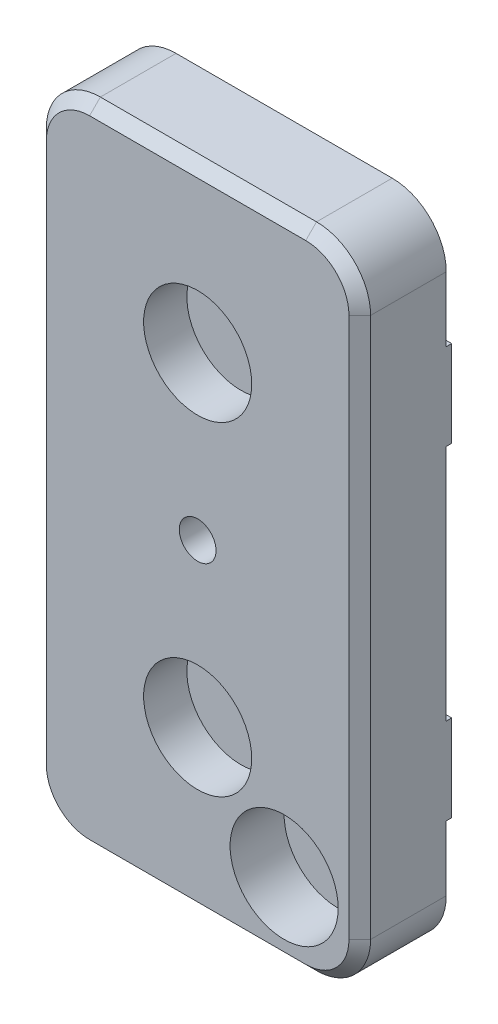
ISO-10303-21;
HEADER;
FILE_DESCRIPTION(('STEP AP214'),'2;1');
FILE_NAME('part.step','',(''),(''),'','','');
FILE_SCHEMA(('AUTOMOTIVE_DESIGN { 1 0 10303 214 1 1 1 1 }'));
ENDSEC;
DATA;
#1=APPLICATION_CONTEXT('core data for automotive mechanical design processes');
#2=APPLICATION_PROTOCOL_DEFINITION('international standard','automotive_design',2000,#1);
#3=PRODUCT_CONTEXT('',#1,'mechanical');
#4=PRODUCT('Part','Part','',(#3));
#5=PRODUCT_RELATED_PRODUCT_CATEGORY('part','',(#4));
#6=PRODUCT_DEFINITION_FORMATION('','',#4);
#7=PRODUCT_DEFINITION_CONTEXT('part definition',#1,'design');
#8=PRODUCT_DEFINITION('design','',#6,#7);
#9=PRODUCT_DEFINITION_SHAPE('','',#8);
#10=(LENGTH_UNIT() NAMED_UNIT(*) SI_UNIT(.MILLI.,.METRE.));
#11=(NAMED_UNIT(*) PLANE_ANGLE_UNIT() SI_UNIT($,.RADIAN.));
#12=(NAMED_UNIT(*) SI_UNIT($,.STERADIAN.) SOLID_ANGLE_UNIT());
#13=UNCERTAINTY_MEASURE_WITH_UNIT(LENGTH_MEASURE(1.E-05),#10,'distance_accuracy_value','');
#14=(GEOMETRIC_REPRESENTATION_CONTEXT(3) GLOBAL_UNCERTAINTY_ASSIGNED_CONTEXT((#13)) GLOBAL_UNIT_ASSIGNED_CONTEXT((#10,
#11,#12)) REPRESENTATION_CONTEXT('',''));
#15=CARTESIAN_POINT('',(0.,0.,0.));
#16=DIRECTION('',(0.,0.,1.));
#17=DIRECTION('',(1.,0.,0.));
#18=AXIS2_PLACEMENT_3D('',#15,#16,#17);
#19=CARTESIAN_POINT('',(0.,-15.,0.));
#20=DIRECTION('',(0.,0.,1.));
#21=DIRECTION('',(1.,0.,0.));
#22=AXIS2_PLACEMENT_3D('',#19,#20,#21);
#23=CYLINDRICAL_SURFACE('',#22,2.24999999999999);
#24=CARTESIAN_POINT('',(0.,-15.,-8.5));
#25=DIRECTION('',(0.,0.,1.));
#26=DIRECTION('',(0.,-1.,0.));
#27=AXIS2_PLACEMENT_3D('',#24,#25,#26);
#28=CIRCLE('',#27,2.24999999999999);
#29=CARTESIAN_POINT('',(0.,-17.25,-8.5));
#30=VERTEX_POINT('',#29);
#31=EDGE_CURVE('E207',#30,#30,#28,.T.);
#32=ORIENTED_EDGE('',*,*,#31,.F.);
#33=EDGE_LOOP('',(#32));
#34=FACE_BOUND('',#33,.T.);
#35=CARTESIAN_POINT('',(0.,-15.,-4.4));
#36=DIRECTION('',(0.,0.,1.));
#37=DIRECTION('',(1.,0.,0.));
#38=AXIS2_PLACEMENT_3D('',#35,#36,#37);
#39=CIRCLE('',#38,2.24999999999999);
#40=CARTESIAN_POINT('',(2.24999999999999,-15.,-4.4));
#41=VERTEX_POINT('',#40);
#42=EDGE_CURVE('E11',#41,#41,#39,.F.);
#43=ORIENTED_EDGE('',*,*,#42,.F.);
#44=EDGE_LOOP('',(#43));
#45=FACE_BOUND('',#44,.T.);
#46=ADVANCED_FACE('F32',(#34,#45),#23,.F.);
#47=CARTESIAN_POINT('',(0.,15.,0.));
#48=DIRECTION('',(0.,0.,1.));
#49=DIRECTION('',(1.,0.,0.));
#50=AXIS2_PLACEMENT_3D('',#47,#48,#49);
#51=CYLINDRICAL_SURFACE('',#50,2.24999999999999);
#52=CARTESIAN_POINT('',(0.,15.,-8.5));
#53=DIRECTION('',(0.,0.,1.));
#54=DIRECTION('',(1.,0.,0.));
#55=AXIS2_PLACEMENT_3D('',#52,#53,#54);
#56=CIRCLE('',#55,2.24999999999999);
#57=CARTESIAN_POINT('',(2.24999999999999,15.,-8.5));
#58=VERTEX_POINT('',#57);
#59=EDGE_CURVE('E486',#58,#58,#56,.T.);
#60=ORIENTED_EDGE('',*,*,#59,.F.);
#61=EDGE_LOOP('',(#60));
#62=FACE_BOUND('',#61,.T.);
#63=CARTESIAN_POINT('',(0.,15.,-4.4));
#64=DIRECTION('',(0.,0.,1.));
#65=DIRECTION('',(1.,0.,0.));
#66=AXIS2_PLACEMENT_3D('',#63,#64,#65);
#67=CIRCLE('',#66,2.24999999999999);
#68=CARTESIAN_POINT('',(2.24999999999999,15.,-4.4));
#69=VERTEX_POINT('',#68);
#70=EDGE_CURVE('E40',#69,#69,#67,.F.);
#71=ORIENTED_EDGE('',*,*,#70,.F.);
#72=EDGE_LOOP('',(#71));
#73=FACE_BOUND('',#72,.T.);
#74=ADVANCED_FACE('F293',(#62,#73),#51,.F.);
#75=CARTESIAN_POINT('',(15.,11.,-8.));
#76=DIRECTION('',(0.,0.,1.));
#77=DIRECTION('',(0.,-1.,0.));
#78=AXIS2_PLACEMENT_3D('',#75,#76,#77);
#79=PLANE('',#78);
#80=CARTESIAN_POINT('',(0.,0.,-8.));
#81=DIRECTION('',(0.,0.,1.));
#82=DIRECTION('',(0.,-1.,0.));
#83=AXIS2_PLACEMENT_3D('',#80,#81,#82);
#84=CIRCLE('',#83,3.25);
#85=CARTESIAN_POINT('',(0.,-3.25,-8.));
#86=VERTEX_POINT('',#85);
#87=EDGE_CURVE('E205',#86,#86,#84,.T.);
#88=ORIENTED_EDGE('',*,*,#87,.T.);
#89=EDGE_LOOP('',(#88));
#90=FACE_BOUND('',#89,.T.);
#91=DIRECTION('',(0.,1.,0.));
#92=VECTOR('',#91,1.);
#93=CARTESIAN_POINT('',(-15.,11.,-8.));
#94=LINE('',#93,#92);
#95=CARTESIAN_POINT('',(-15.,-11.,-8.));
#96=VERTEX_POINT('',#95);
#97=CARTESIAN_POINT('',(-15.,11.,-8.));
#98=VERTEX_POINT('',#97);
#99=EDGE_CURVE('E196',#96,#98,#94,.T.);
#100=ORIENTED_EDGE('',*,*,#99,.T.);
#101=DIRECTION('',(-1.,0.,0.));
#102=VECTOR('',#101,1.);
#103=CARTESIAN_POINT('',(15.,11.,-8.));
#104=LINE('',#103,#102);
#105=CARTESIAN_POINT('',(15.,11.,-8.));
#106=VERTEX_POINT('',#105);
#107=EDGE_CURVE('E175',#106,#98,#104,.T.);
#108=ORIENTED_EDGE('',*,*,#107,.F.);
#109=DIRECTION('',(0.,1.,0.));
#110=VECTOR('',#109,1.);
#111=CARTESIAN_POINT('',(15.,11.,-8.));
#112=LINE('',#111,#110);
#113=CARTESIAN_POINT('',(15.,-11.,-8.));
#114=VERTEX_POINT('',#113);
#115=EDGE_CURVE('E182',#114,#106,#112,.T.);
#116=ORIENTED_EDGE('',*,*,#115,.F.);
#117=DIRECTION('',(-1.,0.,0.));
#118=VECTOR('',#117,1.);
#119=CARTESIAN_POINT('',(15.,-11.,-8.));
#120=LINE('',#119,#118);
#121=EDGE_CURVE('E466',#114,#96,#120,.T.);
#122=ORIENTED_EDGE('',*,*,#121,.T.);
#123=EDGE_LOOP('',(#100,#108,#116,#122));
#124=FACE_BOUND('',#123,.T.);
#125=ADVANCED_FACE('F194',(#90,#124),#79,.F.);
#126=CARTESIAN_POINT('',(15.,11.,-8.));
#127=DIRECTION('',(0.,1.,0.));
#128=DIRECTION('',(0.,0.,1.));
#129=AXIS2_PLACEMENT_3D('',#126,#127,#128);
#130=PLANE('',#129);
#131=DIRECTION('',(0.,0.,-1.));
#132=VECTOR('',#131,1.);
#133=CARTESIAN_POINT('',(-15.,11.,-8.));
#134=LINE('',#133,#132);
#135=CARTESIAN_POINT('',(-15.,11.,-8.5));
#136=VERTEX_POINT('',#135);
#137=EDGE_CURVE('E456',#98,#136,#134,.T.);
#138=ORIENTED_EDGE('',*,*,#137,.T.);
#139=DIRECTION('',(-1.,0.,0.));
#140=VECTOR('',#139,1.);
#141=CARTESIAN_POINT('',(15.,11.,-8.5));
#142=LINE('',#141,#140);
#143=CARTESIAN_POINT('',(15.,11.,-8.5));
#144=VERTEX_POINT('',#143);
#145=EDGE_CURVE('E178',#144,#136,#142,.T.);
#146=ORIENTED_EDGE('',*,*,#145,.F.);
#147=DIRECTION('',(0.,0.,-1.));
#148=VECTOR('',#147,1.);
#149=CARTESIAN_POINT('',(15.,11.,-8.));
#150=LINE('',#149,#148);
#151=EDGE_CURVE('E171',#106,#144,#150,.T.);
#152=ORIENTED_EDGE('',*,*,#151,.F.);
#153=ORIENTED_EDGE('',*,*,#107,.T.);
#154=EDGE_LOOP('',(#138,#146,#152,#153));
#155=FACE_BOUND('',#154,.T.);
#156=ADVANCED_FACE('F173',(#155),#130,.F.);
#157=CARTESIAN_POINT('',(15.,11.,-8.5));
#158=DIRECTION('',(0.,0.,1.));
#159=DIRECTION('',(1.,0.,0.));
#160=AXIS2_PLACEMENT_3D('',#157,#158,#159);
#161=PLANE('',#160);
#162=ORIENTED_EDGE('',*,*,#59,.T.);
#163=EDGE_LOOP('',(#162));
#164=FACE_BOUND('',#163,.T.);
#165=DIRECTION('',(0.,1.,0.));
#166=VECTOR('',#165,1.);
#167=CARTESIAN_POINT('',(-15.,11.,-8.5));
#168=LINE('',#167,#166);
#169=CARTESIAN_POINT('',(-15.,19.,-8.5));
#170=VERTEX_POINT('',#169);
#171=EDGE_CURVE('E450',#136,#170,#168,.T.);
#172=ORIENTED_EDGE('',*,*,#171,.T.);
#173=DIRECTION('',(-1.,0.,0.));
#174=VECTOR('',#173,1.);
#175=CARTESIAN_POINT('',(15.,19.,-8.5));
#176=LINE('',#175,#174);
#177=CARTESIAN_POINT('',(15.,19.,-8.5));
#178=VERTEX_POINT('',#177);
#179=EDGE_CURVE('E201',#178,#170,#176,.T.);
#180=ORIENTED_EDGE('',*,*,#179,.F.);
#181=DIRECTION('',(0.,1.,0.));
#182=VECTOR('',#181,1.);
#183=CARTESIAN_POINT('',(15.,11.,-8.5));
#184=LINE('',#183,#182);
#185=EDGE_CURVE('E181',#144,#178,#184,.T.);
#186=ORIENTED_EDGE('',*,*,#185,.F.);
#187=ORIENTED_EDGE('',*,*,#145,.T.);
#188=EDGE_LOOP('',(#172,#180,#186,#187));
#189=FACE_BOUND('',#188,.T.);
#190=ADVANCED_FACE('F349',(#164,#189),#161,.F.);
#191=CARTESIAN_POINT('',(15.,19.,-7.99999999999999));
#192=DIRECTION('',(0.,-1.,0.));
#193=DIRECTION('',(0.,0.,-1.));
#194=AXIS2_PLACEMENT_3D('',#191,#192,#193);
#195=PLANE('',#194);
#196=DIRECTION('',(0.,0.,1.));
#197=VECTOR('',#196,1.);
#198=CARTESIAN_POINT('',(-15.,19.,-7.99999999999999));
#199=LINE('',#198,#197);
#200=CARTESIAN_POINT('',(-15.,19.,-7.99999999999999));
#201=VERTEX_POINT('',#200);
#202=EDGE_CURVE('E445',#170,#201,#199,.T.);
#203=ORIENTED_EDGE('',*,*,#202,.T.);
#204=DIRECTION('',(-1.,0.,0.));
#205=VECTOR('',#204,1.);
#206=CARTESIAN_POINT('',(15.,19.,-7.99999999999999));
#207=LINE('',#206,#205);
#208=CARTESIAN_POINT('',(15.,19.,-7.99999999999999));
#209=VERTEX_POINT('',#208);
#210=EDGE_CURVE('E432',#209,#201,#207,.T.);
#211=ORIENTED_EDGE('',*,*,#210,.F.);
#212=DIRECTION('',(0.,0.,1.));
#213=VECTOR('',#212,1.);
#214=CARTESIAN_POINT('',(15.,19.,-7.99999999999999));
#215=LINE('',#214,#213);
#216=EDGE_CURVE('E446',#178,#209,#215,.T.);
#217=ORIENTED_EDGE('',*,*,#216,.F.);
#218=ORIENTED_EDGE('',*,*,#179,.T.);
#219=EDGE_LOOP('',(#203,#211,#217,#218));
#220=FACE_BOUND('',#219,.T.);
#221=ADVANCED_FACE('F345',(#220),#195,.F.);
#222=CARTESIAN_POINT('',(15.,19.,-7.99999999999999));
#223=DIRECTION('',(0.,0.,1.));
#224=DIRECTION('',(1.,0.,0.));
#225=AXIS2_PLACEMENT_3D('',#222,#223,#224);
#226=PLANE('',#225);
#227=DIRECTION('',(0.,1.,0.));
#228=VECTOR('',#227,1.);
#229=CARTESIAN_POINT('',(-15.,19.,-7.99999999999999));
#230=LINE('',#229,#228);
#231=CARTESIAN_POINT('',(-15.,25.,-7.99999999999999));
#232=VERTEX_POINT('',#231);
#233=EDGE_CURVE('E452',#201,#232,#230,.T.);
#234=ORIENTED_EDGE('',*,*,#233,.T.);
#235=CARTESIAN_POINT('',(-10.,25.,-7.99999999999999));
#236=DIRECTION('',(0.,0.,1.));
#237=DIRECTION('',(1.,0.,0.));
#238=AXIS2_PLACEMENT_3D('',#235,#236,#237);
#239=CIRCLE('',#238,5.);
#240=CARTESIAN_POINT('',(-10.,30.,-7.99999999999999));
#241=VERTEX_POINT('',#240);
#242=EDGE_CURVE('E218',#232,#241,#239,.F.);
#243=ORIENTED_EDGE('',*,*,#242,.T.);
#244=DIRECTION('',(-1.,0.,0.));
#245=VECTOR('',#244,1.);
#246=CARTESIAN_POINT('',(15.,30.,-7.99999999999999));
#247=LINE('',#246,#245);
#248=CARTESIAN_POINT('',(10.,30.,-7.99999999999999));
#249=VERTEX_POINT('',#248);
#250=EDGE_CURVE('E428',#249,#241,#247,.T.);
#251=ORIENTED_EDGE('',*,*,#250,.F.);
#252=CARTESIAN_POINT('',(10.,25.,-7.99999999999999));
#253=DIRECTION('',(0.,0.,1.));
#254=DIRECTION('',(1.,0.,0.));
#255=AXIS2_PLACEMENT_3D('',#252,#253,#254);
#256=CIRCLE('',#255,5.);
#257=CARTESIAN_POINT('',(15.,25.,-7.99999999999999));
#258=VERTEX_POINT('',#257);
#259=EDGE_CURVE('E216',#249,#258,#256,.F.);
#260=ORIENTED_EDGE('',*,*,#259,.T.);
#261=DIRECTION('',(0.,1.,0.));
#262=VECTOR('',#261,1.);
#263=CARTESIAN_POINT('',(15.,19.,-7.99999999999999));
#264=LINE('',#263,#262);
#265=EDGE_CURVE('E488',#209,#258,#264,.T.);
#266=ORIENTED_EDGE('',*,*,#265,.F.);
#267=ORIENTED_EDGE('',*,*,#210,.T.);
#268=EDGE_LOOP('',(#234,#243,#251,#260,#266,#267));
#269=FACE_BOUND('',#268,.T.);
#270=ADVANCED_FACE('F342',(#269),#226,.F.);
#271=CARTESIAN_POINT('',(15.,30.,-7.99999999999999));
#272=DIRECTION('',(0.,-1.,0.));
#273=DIRECTION('',(0.,0.,-1.));
#274=AXIS2_PLACEMENT_3D('',#271,#272,#273);
#275=PLANE('',#274);
#276=DIRECTION('',(0.,0.,1.));
#277=VECTOR('',#276,1.);
#278=CARTESIAN_POINT('',(-10.,30.,-7.99999999999999));
#279=LINE('',#278,#277);
#280=CARTESIAN_POINT('',(-10.,30.,-1.00000000000001));
#281=VERTEX_POINT('',#280);
#282=EDGE_CURVE('E199',#241,#281,#279,.T.);
#283=ORIENTED_EDGE('',*,*,#282,.T.);
#284=DIRECTION('',(1.,0.,0.));
#285=VECTOR('',#284,1.);
#286=CARTESIAN_POINT('',(15.,30.,-1.00000000000001));
#287=LINE('',#286,#285);
#288=CARTESIAN_POINT('',(10.,30.,-1.00000000000001));
#289=VERTEX_POINT('',#288);
#290=EDGE_CURVE('E54',#281,#289,#287,.T.);
#291=ORIENTED_EDGE('',*,*,#290,.T.);
#292=DIRECTION('',(0.,0.,1.));
#293=VECTOR('',#292,1.);
#294=CARTESIAN_POINT('',(10.,30.,-7.99999999999999));
#295=LINE('',#294,#293);
#296=EDGE_CURVE('E197',#289,#249,#295,.F.);
#297=ORIENTED_EDGE('',*,*,#296,.T.);
#298=ORIENTED_EDGE('',*,*,#250,.T.);
#299=EDGE_LOOP('',(#283,#291,#297,#298));
#300=FACE_BOUND('',#299,.T.);
#301=ADVANCED_FACE('F338',(#300),#275,.F.);
#302=CARTESIAN_POINT('',(15.,30.,0.));
#303=DIRECTION('',(0.,0.,-1.));
#304=DIRECTION('',(0.,1.,0.));
#305=AXIS2_PLACEMENT_3D('',#302,#303,#304);
#306=PLANE('',#305);
#307=CARTESIAN_POINT('',(0.,-15.,0.));
#308=DIRECTION('',(0.,0.,1.));
#309=DIRECTION('',(1.,0.,0.));
#310=AXIS2_PLACEMENT_3D('',#307,#308,#309);
#311=CIRCLE('',#310,5.);
#312=CARTESIAN_POINT('',(5.,-15.,0.));
#313=VERTEX_POINT('',#312);
#314=EDGE_CURVE('E533',#313,#313,#311,.T.);
#315=ORIENTED_EDGE('',*,*,#314,.F.);
#316=EDGE_LOOP('',(#315));
#317=FACE_BOUND('',#316,.T.);
#318=CARTESIAN_POINT('',(0.,15.,0.));
#319=DIRECTION('',(0.,0.,1.));
#320=DIRECTION('',(1.,0.,0.));
#321=AXIS2_PLACEMENT_3D('',#318,#319,#320);
#322=CIRCLE('',#321,5.);
#323=CARTESIAN_POINT('',(5.,15.,0.));
#324=VERTEX_POINT('',#323);
#325=EDGE_CURVE('E527',#324,#324,#322,.T.);
#326=ORIENTED_EDGE('',*,*,#325,.F.);
#327=EDGE_LOOP('',(#326));
#328=FACE_BOUND('',#327,.T.);
#329=CARTESIAN_POINT('',(8.,-23.,0.));
#330=DIRECTION('',(0.,0.,1.));
#331=DIRECTION('',(1.,0.,0.));
#332=AXIS2_PLACEMENT_3D('',#329,#330,#331);
#333=CIRCLE('',#332,5.);
#334=CARTESIAN_POINT('',(13.,-23.,0.));
#335=VERTEX_POINT('',#334);
#336=EDGE_CURVE('E521',#335,#335,#333,.T.);
#337=ORIENTED_EDGE('',*,*,#336,.F.);
#338=EDGE_LOOP('',(#337));
#339=FACE_BOUND('',#338,.T.);
#340=CARTESIAN_POINT('',(-10.,-25.,0.));
#341=DIRECTION('',(0.,0.,-1.));
#342=DIRECTION('',(0.,1.,0.));
#343=AXIS2_PLACEMENT_3D('',#340,#341,#342);
#344=CIRCLE('',#343,4.);
#345=CARTESIAN_POINT('',(-14.,-25.,0.));
#346=VERTEX_POINT('',#345);
#347=CARTESIAN_POINT('',(-10.,-29.,0.));
#348=VERTEX_POINT('',#347);
#349=EDGE_CURVE('E246',#346,#348,#344,.F.);
#350=ORIENTED_EDGE('',*,*,#349,.T.);
#351=DIRECTION('',(1.,0.,0.));
#352=VECTOR('',#351,1.);
#353=CARTESIAN_POINT('',(15.,-29.,0.));
#354=LINE('',#353,#352);
#355=CARTESIAN_POINT('',(10.,-29.,0.));
#356=VERTEX_POINT('',#355);
#357=EDGE_CURVE('E250',#348,#356,#354,.T.);
#358=ORIENTED_EDGE('',*,*,#357,.T.);
#359=CARTESIAN_POINT('',(10.,-25.,0.));
#360=DIRECTION('',(0.,0.,-1.));
#361=DIRECTION('',(0.,1.,0.));
#362=AXIS2_PLACEMENT_3D('',#359,#360,#361);
#363=CIRCLE('',#362,4.);
#364=CARTESIAN_POINT('',(14.,-25.,0.));
#365=VERTEX_POINT('',#364);
#366=EDGE_CURVE('E248',#356,#365,#363,.F.);
#367=ORIENTED_EDGE('',*,*,#366,.T.);
#368=DIRECTION('',(0.,1.,0.));
#369=VECTOR('',#368,1.);
#370=CARTESIAN_POINT('',(14.,25.,0.));
#371=LINE('',#370,#369);
#372=CARTESIAN_POINT('',(14.,25.,0.));
#373=VERTEX_POINT('',#372);
#374=EDGE_CURVE('E244',#365,#373,#371,.T.);
#375=ORIENTED_EDGE('',*,*,#374,.T.);
#376=CARTESIAN_POINT('',(10.,25.,0.));
#377=DIRECTION('',(0.,0.,-1.));
#378=DIRECTION('',(0.,1.,0.));
#379=AXIS2_PLACEMENT_3D('',#376,#377,#378);
#380=CIRCLE('',#379,4.);
#381=CARTESIAN_POINT('',(10.,29.,0.));
#382=VERTEX_POINT('',#381);
#383=EDGE_CURVE('E240',#373,#382,#380,.F.);
#384=ORIENTED_EDGE('',*,*,#383,.T.);
#385=DIRECTION('',(-1.,0.,0.));
#386=VECTOR('',#385,1.);
#387=CARTESIAN_POINT('',(15.,29.,0.));
#388=LINE('',#387,#386);
#389=CARTESIAN_POINT('',(-10.,29.,0.));
#390=VERTEX_POINT('',#389);
#391=EDGE_CURVE('E236',#382,#390,#388,.T.);
#392=ORIENTED_EDGE('',*,*,#391,.T.);
#393=CARTESIAN_POINT('',(-10.,25.,0.));
#394=DIRECTION('',(0.,0.,-1.));
#395=DIRECTION('',(0.,1.,0.));
#396=AXIS2_PLACEMENT_3D('',#393,#394,#395);
#397=CIRCLE('',#396,4.);
#398=CARTESIAN_POINT('',(-14.,25.,0.));
#399=VERTEX_POINT('',#398);
#400=EDGE_CURVE('E238',#390,#399,#397,.F.);
#401=ORIENTED_EDGE('',*,*,#400,.T.);
#402=DIRECTION('',(0.,-1.,0.));
#403=VECTOR('',#402,1.);
#404=CARTESIAN_POINT('',(-14.,30.,0.));
#405=LINE('',#404,#403);
#406=EDGE_CURVE('E242',#399,#346,#405,.T.);
#407=ORIENTED_EDGE('',*,*,#406,.T.);
#408=EDGE_LOOP('',(#350,#358,#367,#375,#384,#392,#401,#407));
#409=FACE_BOUND('',#408,.T.);
#410=CARTESIAN_POINT('',(0.,0.,0.));
#411=DIRECTION('',(0.,0.,-1.));
#412=DIRECTION('',(-1.,0.,0.));
#413=AXIS2_PLACEMENT_3D('',#410,#411,#412);
#414=CIRCLE('',#413,1.7);
#415=CARTESIAN_POINT('',(-1.7,0.,0.));
#416=VERTEX_POINT('',#415);
#417=EDGE_CURVE('E208',#416,#416,#414,.T.);
#418=ORIENTED_EDGE('',*,*,#417,.T.);
#419=EDGE_LOOP('',(#418));
#420=FACE_BOUND('',#419,.T.);
#421=ADVANCED_FACE('F334',(#317,#328,#339,#409,#420),#306,.F.);
#422=CARTESIAN_POINT('',(15.,-30.,-8.));
#423=DIRECTION('',(0.,1.,0.));
#424=DIRECTION('',(0.,0.,1.));
#425=AXIS2_PLACEMENT_3D('',#422,#423,#424);
#426=PLANE('',#425);
#427=DIRECTION('',(0.,0.,-1.));
#428=VECTOR('',#427,1.);
#429=CARTESIAN_POINT('',(10.,-30.,0.));
#430=LINE('',#429,#428);
#431=CARTESIAN_POINT('',(10.,-30.,-8.));
#432=VERTEX_POINT('',#431);
#433=CARTESIAN_POINT('',(10.,-30.,-1.00000000000001));
#434=VERTEX_POINT('',#433);
#435=EDGE_CURVE('E230',#432,#434,#430,.F.);
#436=ORIENTED_EDGE('',*,*,#435,.T.);
#437=DIRECTION('',(-1.,0.,0.));
#438=VECTOR('',#437,1.);
#439=CARTESIAN_POINT('',(15.,-30.,-1.00000000000001));
#440=LINE('',#439,#438);
#441=CARTESIAN_POINT('',(-10.,-30.,-1.00000000000001));
#442=VERTEX_POINT('',#441);
#443=EDGE_CURVE('E233',#434,#442,#440,.T.);
#444=ORIENTED_EDGE('',*,*,#443,.T.);
#445=DIRECTION('',(0.,0.,-1.));
#446=VECTOR('',#445,1.);
#447=CARTESIAN_POINT('',(-10.,-30.,-8.));
#448=LINE('',#447,#446);
#449=CARTESIAN_POINT('',(-10.,-30.,-8.));
#450=VERTEX_POINT('',#449);
#451=EDGE_CURVE('E228',#442,#450,#448,.T.);
#452=ORIENTED_EDGE('',*,*,#451,.T.);
#453=DIRECTION('',(-1.,0.,0.));
#454=VECTOR('',#453,1.);
#455=CARTESIAN_POINT('',(15.,-30.,-8.));
#456=LINE('',#455,#454);
#457=EDGE_CURVE('E426',#432,#450,#456,.T.);
#458=ORIENTED_EDGE('',*,*,#457,.F.);
#459=EDGE_LOOP('',(#436,#444,#452,#458));
#460=FACE_BOUND('',#459,.T.);
#461=ADVANCED_FACE('F330',(#460),#426,.F.);
#462=CARTESIAN_POINT('',(15.,-19.,-8.));
#463=DIRECTION('',(0.,0.,1.));
#464=DIRECTION('',(0.,-1.,0.));
#465=AXIS2_PLACEMENT_3D('',#462,#463,#464);
#466=PLANE('',#465);
#467=DIRECTION('',(0.,1.,0.));
#468=VECTOR('',#467,1.);
#469=CARTESIAN_POINT('',(15.,-19.,-8.));
#470=LINE('',#469,#468);
#471=CARTESIAN_POINT('',(15.,-25.,-8.));
#472=VERTEX_POINT('',#471);
#473=CARTESIAN_POINT('',(15.,-19.,-8.));
#474=VERTEX_POINT('',#473);
#475=EDGE_CURVE('E493',#472,#474,#470,.T.);
#476=ORIENTED_EDGE('',*,*,#475,.F.);
#477=CARTESIAN_POINT('',(10.,-25.,-8.));
#478=DIRECTION('',(0.,0.,1.));
#479=DIRECTION('',(0.,-1.,0.));
#480=AXIS2_PLACEMENT_3D('',#477,#478,#479);
#481=CIRCLE('',#480,5.);
#482=EDGE_CURVE('E226',#472,#432,#481,.F.);
#483=ORIENTED_EDGE('',*,*,#482,.T.);
#484=ORIENTED_EDGE('',*,*,#457,.T.);
#485=CARTESIAN_POINT('',(-10.,-25.,-8.));
#486=DIRECTION('',(0.,0.,1.));
#487=DIRECTION('',(0.,-1.,0.));
#488=AXIS2_PLACEMENT_3D('',#485,#486,#487);
#489=CIRCLE('',#488,5.);
#490=CARTESIAN_POINT('',(-15.,-25.,-8.));
#491=VERTEX_POINT('',#490);
#492=EDGE_CURVE('E224',#450,#491,#489,.F.);
#493=ORIENTED_EDGE('',*,*,#492,.T.);
#494=DIRECTION('',(0.,1.,0.));
#495=VECTOR('',#494,1.);
#496=CARTESIAN_POINT('',(-15.,-19.,-8.));
#497=LINE('',#496,#495);
#498=CARTESIAN_POINT('',(-15.,-19.,-8.));
#499=VERTEX_POINT('',#498);
#500=EDGE_CURVE('E454',#491,#499,#497,.T.);
#501=ORIENTED_EDGE('',*,*,#500,.T.);
#502=DIRECTION('',(-1.,0.,0.));
#503=VECTOR('',#502,1.);
#504=CARTESIAN_POINT('',(15.,-19.,-8.));
#505=LINE('',#504,#503);
#506=EDGE_CURVE('E429',#474,#499,#505,.T.);
#507=ORIENTED_EDGE('',*,*,#506,.F.);
#508=EDGE_LOOP('',(#476,#483,#484,#493,#501,#507));
#509=FACE_BOUND('',#508,.T.);
#510=ADVANCED_FACE('F326',(#509),#466,.F.);
#511=CARTESIAN_POINT('',(15.,-19.,-8.));
#512=DIRECTION('',(0.,1.,0.));
#513=DIRECTION('',(0.,0.,1.));
#514=AXIS2_PLACEMENT_3D('',#511,#512,#513);
#515=PLANE('',#514);
#516=DIRECTION('',(0.,0.,-1.));
#517=VECTOR('',#516,1.);
#518=CARTESIAN_POINT('',(-15.,-19.,-8.));
#519=LINE('',#518,#517);
#520=CARTESIAN_POINT('',(-15.,-19.,-8.5));
#521=VERTEX_POINT('',#520);
#522=EDGE_CURVE('E461',#499,#521,#519,.T.);
#523=ORIENTED_EDGE('',*,*,#522,.T.);
#524=DIRECTION('',(-1.,0.,0.));
#525=VECTOR('',#524,1.);
#526=CARTESIAN_POINT('',(15.,-19.,-8.5));
#527=LINE('',#526,#525);
#528=CARTESIAN_POINT('',(15.,-19.,-8.5));
#529=VERTEX_POINT('',#528);
#530=EDGE_CURVE('E435',#529,#521,#527,.T.);
#531=ORIENTED_EDGE('',*,*,#530,.F.);
#532=DIRECTION('',(0.,0.,-1.));
#533=VECTOR('',#532,1.);
#534=CARTESIAN_POINT('',(15.,-19.,-8.));
#535=LINE('',#534,#533);
#536=EDGE_CURVE('E482',#474,#529,#535,.T.);
#537=ORIENTED_EDGE('',*,*,#536,.F.);
#538=ORIENTED_EDGE('',*,*,#506,.T.);
#539=EDGE_LOOP('',(#523,#531,#537,#538));
#540=FACE_BOUND('',#539,.T.);
#541=ADVANCED_FACE('F322',(#540),#515,.F.);
#542=CARTESIAN_POINT('',(15.,-11.,-8.5));
#543=DIRECTION('',(0.,0.,1.));
#544=DIRECTION('',(0.,-1.,0.));
#545=AXIS2_PLACEMENT_3D('',#542,#543,#544);
#546=PLANE('',#545);
#547=ORIENTED_EDGE('',*,*,#31,.T.);
#548=EDGE_LOOP('',(#547));
#549=FACE_BOUND('',#548,.T.);
#550=DIRECTION('',(0.,1.,0.));
#551=VECTOR('',#550,1.);
#552=CARTESIAN_POINT('',(-15.,-11.,-8.5));
#553=LINE('',#552,#551);
#554=CARTESIAN_POINT('',(-15.,-11.,-8.5));
#555=VERTEX_POINT('',#554);
#556=EDGE_CURVE('E463',#521,#555,#553,.T.);
#557=ORIENTED_EDGE('',*,*,#556,.T.);
#558=DIRECTION('',(-1.,0.,0.));
#559=VECTOR('',#558,1.);
#560=CARTESIAN_POINT('',(15.,-11.,-8.5));
#561=LINE('',#560,#559);
#562=CARTESIAN_POINT('',(15.,-11.,-8.5));
#563=VERTEX_POINT('',#562);
#564=EDGE_CURVE('E468',#563,#555,#561,.T.);
#565=ORIENTED_EDGE('',*,*,#564,.F.);
#566=DIRECTION('',(0.,1.,0.));
#567=VECTOR('',#566,1.);
#568=CARTESIAN_POINT('',(15.,-11.,-8.5));
#569=LINE('',#568,#567);
#570=EDGE_CURVE('E476',#529,#563,#569,.T.);
#571=ORIENTED_EDGE('',*,*,#570,.F.);
#572=ORIENTED_EDGE('',*,*,#530,.T.);
#573=EDGE_LOOP('',(#557,#565,#571,#572));
#574=FACE_BOUND('',#573,.T.);
#575=ADVANCED_FACE('F318',(#549,#574),#546,.F.);
#576=CARTESIAN_POINT('',(15.,-11.,-8.));
#577=DIRECTION('',(0.,-1.,0.));
#578=DIRECTION('',(0.,0.,-1.));
#579=AXIS2_PLACEMENT_3D('',#576,#577,#578);
#580=PLANE('',#579);
#581=DIRECTION('',(0.,0.,1.));
#582=VECTOR('',#581,1.);
#583=CARTESIAN_POINT('',(-15.,-11.,-8.));
#584=LINE('',#583,#582);
#585=EDGE_CURVE('E192',#555,#96,#584,.T.);
#586=ORIENTED_EDGE('',*,*,#585,.T.);
#587=ORIENTED_EDGE('',*,*,#121,.F.);
#588=DIRECTION('',(0.,0.,1.));
#589=VECTOR('',#588,1.);
#590=CARTESIAN_POINT('',(15.,-11.,-8.));
#591=LINE('',#590,#589);
#592=EDGE_CURVE('E188',#563,#114,#591,.T.);
#593=ORIENTED_EDGE('',*,*,#592,.F.);
#594=ORIENTED_EDGE('',*,*,#564,.T.);
#595=EDGE_LOOP('',(#586,#587,#593,#594));
#596=FACE_BOUND('',#595,.T.);
#597=ADVANCED_FACE('F311',(#596),#580,.F.);
#598=CARTESIAN_POINT('',(15.,0.,0.));
#599=DIRECTION('',(1.,0.,0.));
#600=DIRECTION('',(0.,0.,-1.));
#601=AXIS2_PLACEMENT_3D('',#598,#599,#600);
#602=PLANE('',#601);
#603=DIRECTION('',(0.,0.,1.));
#604=VECTOR('',#603,1.);
#605=CARTESIAN_POINT('',(15.,25.,0.));
#606=LINE('',#605,#604);
#607=CARTESIAN_POINT('',(15.,25.,-1.00000000000001));
#608=VERTEX_POINT('',#607);
#609=EDGE_CURVE('E222',#258,#608,#606,.T.);
#610=ORIENTED_EDGE('',*,*,#609,.T.);
#611=DIRECTION('',(0.,-1.,0.));
#612=VECTOR('',#611,1.);
#613=CARTESIAN_POINT('',(15.,-25.,-1.00000000000001));
#614=LINE('',#613,#612);
#615=CARTESIAN_POINT('',(15.,-25.,-1.00000000000001));
#616=VERTEX_POINT('',#615);
#617=EDGE_CURVE('E257',#608,#616,#614,.T.);
#618=ORIENTED_EDGE('',*,*,#617,.T.);
#619=DIRECTION('',(0.,0.,-1.));
#620=VECTOR('',#619,1.);
#621=CARTESIAN_POINT('',(15.,-25.,-8.));
#622=LINE('',#621,#620);
#623=EDGE_CURVE('E220',#616,#472,#622,.T.);
#624=ORIENTED_EDGE('',*,*,#623,.T.);
#625=ORIENTED_EDGE('',*,*,#475,.T.);
#626=ORIENTED_EDGE('',*,*,#536,.T.);
#627=ORIENTED_EDGE('',*,*,#570,.T.);
#628=ORIENTED_EDGE('',*,*,#592,.T.);
#629=ORIENTED_EDGE('',*,*,#115,.T.);
#630=ORIENTED_EDGE('',*,*,#151,.T.);
#631=ORIENTED_EDGE('',*,*,#185,.T.);
#632=ORIENTED_EDGE('',*,*,#216,.T.);
#633=ORIENTED_EDGE('',*,*,#265,.T.);
#634=EDGE_LOOP('',(#610,#618,#624,#625,#626,#627,#628,#629,#630,#631,#632,#633));
#635=FACE_BOUND('',#634,.T.);
#636=ADVANCED_FACE('F186',(#635),#602,.T.);
#637=CARTESIAN_POINT('',(-15.,0.,0.));
#638=DIRECTION('',(1.,0.,0.));
#639=DIRECTION('',(0.,0.,-1.));
#640=AXIS2_PLACEMENT_3D('',#637,#638,#639);
#641=PLANE('',#640);
#642=DIRECTION('',(0.,0.,-1.));
#643=VECTOR('',#642,1.);
#644=CARTESIAN_POINT('',(-15.,-25.,0.));
#645=LINE('',#644,#643);
#646=CARTESIAN_POINT('',(-15.,-25.,-1.00000000000001));
#647=VERTEX_POINT('',#646);
#648=EDGE_CURVE('E211',#491,#647,#645,.F.);
#649=ORIENTED_EDGE('',*,*,#648,.T.);
#650=DIRECTION('',(0.,1.,0.));
#651=VECTOR('',#650,1.);
#652=CARTESIAN_POINT('',(-15.,0.,-1.00000000000001));
#653=LINE('',#652,#651);
#654=CARTESIAN_POINT('',(-15.,25.,-1.00000000000001));
#655=VERTEX_POINT('',#654);
#656=EDGE_CURVE('E259',#647,#655,#653,.T.);
#657=ORIENTED_EDGE('',*,*,#656,.T.);
#658=DIRECTION('',(0.,0.,1.));
#659=VECTOR('',#658,1.);
#660=CARTESIAN_POINT('',(-15.,25.,0.));
#661=LINE('',#660,#659);
#662=EDGE_CURVE('E214',#655,#232,#661,.F.);
#663=ORIENTED_EDGE('',*,*,#662,.T.);
#664=ORIENTED_EDGE('',*,*,#233,.F.);
#665=ORIENTED_EDGE('',*,*,#202,.F.);
#666=ORIENTED_EDGE('',*,*,#171,.F.);
#667=ORIENTED_EDGE('',*,*,#137,.F.);
#668=ORIENTED_EDGE('',*,*,#99,.F.);
#669=ORIENTED_EDGE('',*,*,#585,.F.);
#670=ORIENTED_EDGE('',*,*,#556,.F.);
#671=ORIENTED_EDGE('',*,*,#522,.F.);
#672=ORIENTED_EDGE('',*,*,#500,.F.);
#673=EDGE_LOOP('',(#649,#657,#663,#664,#665,#666,#667,#668,#669,#670,#671,#672));
#674=FACE_BOUND('',#673,.T.);
#675=ADVANCED_FACE('F310',(#674),#641,.F.);
#676=CARTESIAN_POINT('',(0.,0.,-8.5));
#677=DIRECTION('',(0.,0.,-1.));
#678=DIRECTION('',(-1.,0.,0.));
#679=AXIS2_PLACEMENT_3D('',#676,#677,#678);
#680=CYLINDRICAL_SURFACE('',#679,3.25);
#681=CARTESIAN_POINT('',(0.,0.,-2.5));
#682=DIRECTION('',(0.,0.,-1.));
#683=DIRECTION('',(-1.,0.,0.));
#684=AXIS2_PLACEMENT_3D('',#681,#682,#683);
#685=CIRCLE('',#684,3.25);
#686=CARTESIAN_POINT('',(-3.25,0.,-2.5));
#687=VERTEX_POINT('',#686);
#688=EDGE_CURVE('E287',#687,#687,#685,.T.);
#689=ORIENTED_EDGE('',*,*,#688,.F.);
#690=EDGE_LOOP('',(#689));
#691=FACE_BOUND('',#690,.T.);
#692=ORIENTED_EDGE('',*,*,#87,.F.);
#693=EDGE_LOOP('',(#692));
#694=FACE_BOUND('',#693,.T.);
#695=ADVANCED_FACE('F314',(#691,#694),#680,.F.);
#696=CARTESIAN_POINT('',(0.,0.,-8.5));
#697=DIRECTION('',(0.,0.,-1.));
#698=DIRECTION('',(-1.,0.,0.));
#699=AXIS2_PLACEMENT_3D('',#696,#697,#698);
#700=CYLINDRICAL_SURFACE('',#699,1.7);
#701=ORIENTED_EDGE('',*,*,#417,.F.);
#702=EDGE_LOOP('',(#701));
#703=FACE_BOUND('',#702,.T.);
#704=CARTESIAN_POINT('',(0.,0.,-2.5));
#705=DIRECTION('',(0.,0.,-1.));
#706=DIRECTION('',(-1.,0.,0.));
#707=AXIS2_PLACEMENT_3D('',#704,#705,#706);
#708=CIRCLE('',#707,1.7);
#709=CARTESIAN_POINT('',(-1.7,0.,-2.5));
#710=VERTEX_POINT('',#709);
#711=EDGE_CURVE('E516',#710,#710,#708,.T.);
#712=ORIENTED_EDGE('',*,*,#711,.T.);
#713=EDGE_LOOP('',(#712));
#714=FACE_BOUND('',#713,.T.);
#715=ADVANCED_FACE('F566',(#703,#714),#700,.F.);
#716=CARTESIAN_POINT('',(1.7,0.,-2.5));
#717=DIRECTION('',(0.,0.,1.));
#718=DIRECTION('',(1.,0.,0.));
#719=AXIS2_PLACEMENT_3D('',#716,#717,#718);
#720=PLANE('',#719);
#721=ORIENTED_EDGE('',*,*,#711,.F.);
#722=EDGE_LOOP('',(#721));
#723=FACE_BOUND('',#722,.T.);
#724=ORIENTED_EDGE('',*,*,#688,.T.);
#725=EDGE_LOOP('',(#724));
#726=FACE_BOUND('',#725,.T.);
#727=ADVANCED_FACE('F360',(#723,#726),#720,.F.);
#728=CARTESIAN_POINT('',(-10.,25.,-7.99999999999999));
#729=DIRECTION('',(0.,0.,1.));
#730=DIRECTION('',(1.,0.,0.));
#731=AXIS2_PLACEMENT_3D('',#728,#729,#730);
#732=CYLINDRICAL_SURFACE('',#731,5.);
#733=ORIENTED_EDGE('',*,*,#662,.F.);
#734=CARTESIAN_POINT('',(-10.,25.,-1.00000000000001));
#735=DIRECTION('',(0.,0.,-1.));
#736=DIRECTION('',(-1.,0.,0.));
#737=AXIS2_PLACEMENT_3D('',#734,#735,#736);
#738=CIRCLE('',#737,5.);
#739=EDGE_CURVE('E47',#655,#281,#738,.T.);
#740=ORIENTED_EDGE('',*,*,#739,.T.);
#741=ORIENTED_EDGE('',*,*,#282,.F.);
#742=ORIENTED_EDGE('',*,*,#242,.F.);
#743=EDGE_LOOP('',(#733,#740,#741,#742));
#744=FACE_BOUND('',#743,.T.);
#745=ADVANCED_FACE('F356',(#744),#732,.T.);
#746=CARTESIAN_POINT('',(10.,25.,0.));
#747=DIRECTION('',(0.,0.,-1.));
#748=DIRECTION('',(-1.,0.,0.));
#749=AXIS2_PLACEMENT_3D('',#746,#747,#748);
#750=CYLINDRICAL_SURFACE('',#749,5.);
#751=ORIENTED_EDGE('',*,*,#296,.F.);
#752=CARTESIAN_POINT('',(10.,25.,-1.00000000000001));
#753=DIRECTION('',(0.,0.,-1.));
#754=DIRECTION('',(-1.,0.,0.));
#755=AXIS2_PLACEMENT_3D('',#752,#753,#754);
#756=CIRCLE('',#755,5.);
#757=EDGE_CURVE('E261',#289,#608,#756,.T.);
#758=ORIENTED_EDGE('',*,*,#757,.T.);
#759=ORIENTED_EDGE('',*,*,#609,.F.);
#760=ORIENTED_EDGE('',*,*,#259,.F.);
#761=EDGE_LOOP('',(#751,#758,#759,#760));
#762=FACE_BOUND('',#761,.T.);
#763=ADVANCED_FACE('F359',(#762),#750,.T.);
#764=CARTESIAN_POINT('',(10.,-25.,0.));
#765=DIRECTION('',(0.,0.,1.));
#766=DIRECTION('',(1.,0.,0.));
#767=AXIS2_PLACEMENT_3D('',#764,#765,#766);
#768=CYLINDRICAL_SURFACE('',#767,5.);
#769=ORIENTED_EDGE('',*,*,#623,.F.);
#770=CARTESIAN_POINT('',(10.,-25.,-1.00000000000001));
#771=DIRECTION('',(0.,0.,-1.));
#772=DIRECTION('',(-1.,0.,0.));
#773=AXIS2_PLACEMENT_3D('',#770,#771,#772);
#774=CIRCLE('',#773,5.);
#775=EDGE_CURVE('E253',#616,#434,#774,.T.);
#776=ORIENTED_EDGE('',*,*,#775,.T.);
#777=ORIENTED_EDGE('',*,*,#435,.F.);
#778=ORIENTED_EDGE('',*,*,#482,.F.);
#779=EDGE_LOOP('',(#769,#776,#777,#778));
#780=FACE_BOUND('',#779,.T.);
#781=ADVANCED_FACE('F363',(#780),#768,.T.);
#782=CARTESIAN_POINT('',(-10.,-25.,-8.));
#783=DIRECTION('',(0.,0.,-1.));
#784=DIRECTION('',(-1.,0.,0.));
#785=AXIS2_PLACEMENT_3D('',#782,#783,#784);
#786=CYLINDRICAL_SURFACE('',#785,5.);
#787=ORIENTED_EDGE('',*,*,#451,.F.);
#788=CARTESIAN_POINT('',(-10.,-25.,-1.00000000000001));
#789=DIRECTION('',(0.,0.,-1.));
#790=DIRECTION('',(-1.,0.,0.));
#791=AXIS2_PLACEMENT_3D('',#788,#789,#790);
#792=CIRCLE('',#791,5.);
#793=EDGE_CURVE('E255',#442,#647,#792,.T.);
#794=ORIENTED_EDGE('',*,*,#793,.T.);
#795=ORIENTED_EDGE('',*,*,#648,.F.);
#796=ORIENTED_EDGE('',*,*,#492,.F.);
#797=EDGE_LOOP('',(#787,#794,#795,#796));
#798=FACE_BOUND('',#797,.T.);
#799=ADVANCED_FACE('F367',(#798),#786,.T.);
#800=CARTESIAN_POINT('',(15.,29.,0.));
#801=DIRECTION('',(0.,-0.70710678118655,-0.707106781186545));
#802=DIRECTION('',(-1.,0.,0.));
#803=AXIS2_PLACEMENT_3D('',#800,#801,#802);
#804=PLANE('',#803);
#805=DIRECTION('',(0.,0.707106781186545,-0.70710678118655));
#806=VECTOR('',#805,1.);
#807=CARTESIAN_POINT('',(-10.,29.,0.));
#808=LINE('',#807,#806);
#809=EDGE_CURVE('E282',#390,#281,#808,.T.);
#810=ORIENTED_EDGE('',*,*,#809,.F.);
#811=ORIENTED_EDGE('',*,*,#391,.F.);
#812=DIRECTION('',(0.,-0.707106781186545,0.70710678118655));
#813=VECTOR('',#812,1.);
#814=CARTESIAN_POINT('',(10.,30.,-1.00000000000001));
#815=LINE('',#814,#813);
#816=EDGE_CURVE('E285',#289,#382,#815,.T.);
#817=ORIENTED_EDGE('',*,*,#816,.F.);
#818=ORIENTED_EDGE('',*,*,#290,.F.);
#819=EDGE_LOOP('',(#810,#811,#817,#818));
#820=FACE_BOUND('',#819,.T.);
#821=ADVANCED_FACE('F34',(#820),#804,.F.);
#822=CARTESIAN_POINT('',(10.,25.,0.));
#823=DIRECTION('',(0.,0.,-1.));
#824=DIRECTION('',(-1.,0.,0.));
#825=AXIS2_PLACEMENT_3D('',#822,#823,#824);
#826=CONICAL_SURFACE('',#825,4.,0.785398163397444);
#827=ORIENTED_EDGE('',*,*,#816,.T.);
#828=ORIENTED_EDGE('',*,*,#383,.F.);
#829=DIRECTION('',(-0.707106781186545,0.,0.70710678118655));
#830=VECTOR('',#829,1.);
#831=CARTESIAN_POINT('',(15.,25.,-1.00000000000001));
#832=LINE('',#831,#830);
#833=EDGE_CURVE('E279',#608,#373,#832,.T.);
#834=ORIENTED_EDGE('',*,*,#833,.F.);
#835=ORIENTED_EDGE('',*,*,#757,.F.);
#836=EDGE_LOOP('',(#827,#828,#834,#835));
#837=FACE_BOUND('',#836,.T.);
#838=ADVANCED_FACE('F395',(#837),#826,.T.);
#839=CARTESIAN_POINT('',(-10.,25.,0.));
#840=DIRECTION('',(0.,0.,-1.));
#841=DIRECTION('',(-1.,0.,0.));
#842=AXIS2_PLACEMENT_3D('',#839,#840,#841);
#843=CONICAL_SURFACE('',#842,4.,0.785398163397444);
#844=ORIENTED_EDGE('',*,*,#809,.T.);
#845=ORIENTED_EDGE('',*,*,#739,.F.);
#846=DIRECTION('',(-0.707106781186545,0.,-0.70710678118655));
#847=VECTOR('',#846,1.);
#848=CARTESIAN_POINT('',(-14.,25.,0.));
#849=LINE('',#848,#847);
#850=EDGE_CURVE('E276',#399,#655,#849,.T.);
#851=ORIENTED_EDGE('',*,*,#850,.F.);
#852=ORIENTED_EDGE('',*,*,#400,.F.);
#853=EDGE_LOOP('',(#844,#845,#851,#852));
#854=FACE_BOUND('',#853,.T.);
#855=ADVANCED_FACE('F392',(#854),#843,.T.);
#856=CARTESIAN_POINT('',(15.,0.,-1.00000000000001));
#857=DIRECTION('',(0.70710678118655,0.,0.707106781186545));
#858=DIRECTION('',(0.,1.,0.));
#859=AXIS2_PLACEMENT_3D('',#856,#857,#858);
#860=PLANE('',#859);
#861=ORIENTED_EDGE('',*,*,#833,.T.);
#862=ORIENTED_EDGE('',*,*,#374,.F.);
#863=DIRECTION('',(-0.707106781186545,0.,0.70710678118655));
#864=VECTOR('',#863,1.);
#865=CARTESIAN_POINT('',(15.,-25.,-1.00000000000001));
#866=LINE('',#865,#864);
#867=EDGE_CURVE('E273',#616,#365,#866,.T.);
#868=ORIENTED_EDGE('',*,*,#867,.F.);
#869=ORIENTED_EDGE('',*,*,#617,.F.);
#870=EDGE_LOOP('',(#861,#862,#868,#869));
#871=FACE_BOUND('',#870,.T.);
#872=ADVANCED_FACE('F388',(#871),#860,.T.);
#873=CARTESIAN_POINT('',(-14.,30.,0.));
#874=DIRECTION('',(0.70710678118655,0.,-0.707106781186545));
#875=DIRECTION('',(0.,-1.,0.));
#876=AXIS2_PLACEMENT_3D('',#873,#874,#875);
#877=PLANE('',#876);
#878=ORIENTED_EDGE('',*,*,#850,.T.);
#879=ORIENTED_EDGE('',*,*,#656,.F.);
#880=DIRECTION('',(-0.707106781186545,0.,-0.70710678118655));
#881=VECTOR('',#880,1.);
#882=CARTESIAN_POINT('',(-14.,-25.,0.));
#883=LINE('',#882,#881);
#884=EDGE_CURVE('E270',#346,#647,#883,.T.);
#885=ORIENTED_EDGE('',*,*,#884,.F.);
#886=ORIENTED_EDGE('',*,*,#406,.F.);
#887=EDGE_LOOP('',(#878,#879,#885,#886));
#888=FACE_BOUND('',#887,.T.);
#889=ADVANCED_FACE('F384',(#888),#877,.F.);
#890=CARTESIAN_POINT('',(10.,-25.,0.));
#891=DIRECTION('',(0.,0.,-1.));
#892=DIRECTION('',(-1.,0.,0.));
#893=AXIS2_PLACEMENT_3D('',#890,#891,#892);
#894=CONICAL_SURFACE('',#893,4.,0.785398163397444);
#895=ORIENTED_EDGE('',*,*,#867,.T.);
#896=ORIENTED_EDGE('',*,*,#366,.F.);
#897=DIRECTION('',(0.,0.707106781186545,0.70710678118655));
#898=VECTOR('',#897,1.);
#899=CARTESIAN_POINT('',(10.,-30.,-1.00000000000001));
#900=LINE('',#899,#898);
#901=EDGE_CURVE('E267',#434,#356,#900,.T.);
#902=ORIENTED_EDGE('',*,*,#901,.F.);
#903=ORIENTED_EDGE('',*,*,#775,.F.);
#904=EDGE_LOOP('',(#895,#896,#902,#903));
#905=FACE_BOUND('',#904,.T.);
#906=ADVANCED_FACE('F380',(#905),#894,.T.);
#907=CARTESIAN_POINT('',(-10.,-25.,0.));
#908=DIRECTION('',(0.,0.,-1.));
#909=DIRECTION('',(-1.,0.,0.));
#910=AXIS2_PLACEMENT_3D('',#907,#908,#909);
#911=CONICAL_SURFACE('',#910,4.,0.785398163397445);
#912=ORIENTED_EDGE('',*,*,#884,.T.);
#913=ORIENTED_EDGE('',*,*,#793,.F.);
#914=DIRECTION('',(0.,-0.707106781186545,-0.70710678118655));
#915=VECTOR('',#914,1.);
#916=CARTESIAN_POINT('',(-10.,-29.,0.));
#917=LINE('',#916,#915);
#918=EDGE_CURVE('E265',#348,#442,#917,.T.);
#919=ORIENTED_EDGE('',*,*,#918,.F.);
#920=ORIENTED_EDGE('',*,*,#349,.F.);
#921=EDGE_LOOP('',(#912,#913,#919,#920));
#922=FACE_BOUND('',#921,.T.);
#923=ADVANCED_FACE('F376',(#922),#911,.T.);
#924=CARTESIAN_POINT('',(15.,-30.,-1.00000000000001));
#925=DIRECTION('',(0.,0.70710678118655,-0.707106781186545));
#926=DIRECTION('',(-1.,0.,0.));
#927=AXIS2_PLACEMENT_3D('',#924,#925,#926);
#928=PLANE('',#927);
#929=ORIENTED_EDGE('',*,*,#901,.T.);
#930=ORIENTED_EDGE('',*,*,#357,.F.);
#931=ORIENTED_EDGE('',*,*,#918,.T.);
#932=ORIENTED_EDGE('',*,*,#443,.F.);
#933=EDGE_LOOP('',(#929,#930,#931,#932));
#934=FACE_BOUND('',#933,.T.);
#935=ADVANCED_FACE('F372',(#934),#928,.F.);
#936=CARTESIAN_POINT('',(8.,-23.,-5.));
#937=DIRECTION('',(0.,0.,1.));
#938=DIRECTION('',(1.,0.,0.));
#939=AXIS2_PLACEMENT_3D('',#936,#937,#938);
#940=CYLINDRICAL_SURFACE('',#939,5.);
#941=CARTESIAN_POINT('',(8.,-23.,-5.));
#942=DIRECTION('',(0.,0.,1.));
#943=DIRECTION('',(1.,0.,0.));
#944=AXIS2_PLACEMENT_3D('',#941,#942,#943);
#945=CIRCLE('',#944,5.);
#946=CARTESIAN_POINT('',(13.,-23.,-5.));
#947=VERTEX_POINT('',#946);
#948=EDGE_CURVE('E268',#947,#947,#945,.T.);
#949=ORIENTED_EDGE('',*,*,#948,.F.);
#950=EDGE_LOOP('',(#949));
#951=FACE_BOUND('',#950,.T.);
#952=ORIENTED_EDGE('',*,*,#336,.T.);
#953=EDGE_LOOP('',(#952));
#954=FACE_BOUND('',#953,.T.);
#955=ADVANCED_FACE('F375',(#951,#954),#940,.F.);
#956=CARTESIAN_POINT('',(8.,-23.,-5.));
#957=DIRECTION('',(0.,0.,1.));
#958=DIRECTION('',(1.,0.,0.));
#959=AXIS2_PLACEMENT_3D('',#956,#957,#958);
#960=PLANE('',#959);
#961=ORIENTED_EDGE('',*,*,#948,.T.);
#962=EDGE_LOOP('',(#961));
#963=FACE_BOUND('',#962,.T.);
#964=ADVANCED_FACE('F552',(#963),#960,.T.);
#965=CARTESIAN_POINT('',(0.,15.,-4.));
#966=DIRECTION('',(0.,0.,1.));
#967=DIRECTION('',(1.,0.,0.));
#968=AXIS2_PLACEMENT_3D('',#965,#966,#967);
#969=PLANE('',#968);
#970=CARTESIAN_POINT('',(0.,15.,-4.));
#971=DIRECTION('',(0.,0.,1.));
#972=DIRECTION('',(1.,0.,0.));
#973=AXIS2_PLACEMENT_3D('',#970,#971,#972);
#974=CIRCLE('',#973,5.);
#975=CARTESIAN_POINT('',(5.,15.,-4.));
#976=VERTEX_POINT('',#975);
#977=EDGE_CURVE('E524',#976,#976,#974,.T.);
#978=ORIENTED_EDGE('',*,*,#977,.T.);
#979=EDGE_LOOP('',(#978));
#980=FACE_BOUND('',#979,.T.);
#981=ADVANCED_FACE('F558',(#980),#969,.T.);
#982=CARTESIAN_POINT('',(0.,15.,-4.));
#983=DIRECTION('',(0.,0.,1.));
#984=DIRECTION('',(1.,0.,0.));
#985=AXIS2_PLACEMENT_3D('',#982,#983,#984);
#986=CYLINDRICAL_SURFACE('',#985,5.);
#987=ORIENTED_EDGE('',*,*,#977,.F.);
#988=EDGE_LOOP('',(#987));
#989=FACE_BOUND('',#988,.T.);
#990=ORIENTED_EDGE('',*,*,#325,.T.);
#991=EDGE_LOOP('',(#990));
#992=FACE_BOUND('',#991,.T.);
#993=ADVANCED_FACE('F674',(#989,#992),#986,.F.);
#994=CARTESIAN_POINT('',(0.,-15.,-4.));
#995=DIRECTION('',(0.,0.,1.));
#996=DIRECTION('',(1.,0.,0.));
#997=AXIS2_PLACEMENT_3D('',#994,#995,#996);
#998=PLANE('',#997);
#999=CARTESIAN_POINT('',(0.,-15.,-4.));
#1000=DIRECTION('',(0.,0.,1.));
#1001=DIRECTION('',(1.,0.,0.));
#1002=AXIS2_PLACEMENT_3D('',#999,#1000,#1001);
#1003=CIRCLE('',#1002,5.);
#1004=CARTESIAN_POINT('',(5.,-15.,-4.));
#1005=VERTEX_POINT('',#1004);
#1006=EDGE_CURVE('E530',#1005,#1005,#1003,.T.);
#1007=ORIENTED_EDGE('',*,*,#1006,.T.);
#1008=EDGE_LOOP('',(#1007));
#1009=FACE_BOUND('',#1008,.T.);
#1010=ADVANCED_FACE('F539',(#1009),#998,.T.);
#1011=CARTESIAN_POINT('',(0.,-15.,-4.));
#1012=DIRECTION('',(0.,0.,1.));
#1013=DIRECTION('',(1.,0.,0.));
#1014=AXIS2_PLACEMENT_3D('',#1011,#1012,#1013);
#1015=CYLINDRICAL_SURFACE('',#1014,5.);
#1016=ORIENTED_EDGE('',*,*,#1006,.F.);
#1017=EDGE_LOOP('',(#1016));
#1018=FACE_BOUND('',#1017,.T.);
#1019=ORIENTED_EDGE('',*,*,#314,.T.);
#1020=EDGE_LOOP('',(#1019));
#1021=FACE_BOUND('',#1020,.T.);
#1022=ADVANCED_FACE('F541',(#1018,#1021),#1015,.F.);
#1023=CARTESIAN_POINT('',(0.,15.,-4.4));
#1024=DIRECTION('',(0.,0.,1.));
#1025=DIRECTION('',(1.,0.,0.));
#1026=AXIS2_PLACEMENT_3D('',#1023,#1024,#1025);
#1027=PLANE('',#1026);
#1028=ORIENTED_EDGE('',*,*,#70,.T.);
#1029=EDGE_LOOP('',(#1028));
#1030=FACE_BOUND('',#1029,.T.);
#1031=ADVANCED_FACE('F291',(#1030),#1027,.F.);
#1032=CARTESIAN_POINT('',(0.,-15.,-4.4));
#1033=DIRECTION('',(0.,0.,1.));
#1034=DIRECTION('',(1.,0.,0.));
#1035=AXIS2_PLACEMENT_3D('',#1032,#1033,#1034);
#1036=PLANE('',#1035);
#1037=ORIENTED_EDGE('',*,*,#42,.T.);
#1038=EDGE_LOOP('',(#1037));
#1039=FACE_BOUND('',#1038,.T.);
#1040=ADVANCED_FACE('F720',(#1039),#1036,.F.);
#1041=CLOSED_SHELL('',(#46,#74,#125,#156,#190,#221,#270,#301,#421,#461,#510,#541,#575,#597,#636,
#675,#695,#715,#727,#745,#763,#781,#799,#821,#838,#855,#872,#889,#906,#923,#935,#955,#964,#981,
#993,#1010,#1022,#1031,#1040));
#1042=MANIFOLD_SOLID_BREP('B2',#1041);
#1043=ADVANCED_BREP_SHAPE_REPRESENTATION('',(#18,#1042),#14);
#1044=SHAPE_DEFINITION_REPRESENTATION(#9,#1043);
ENDSEC;
END-ISO-10303-21;
